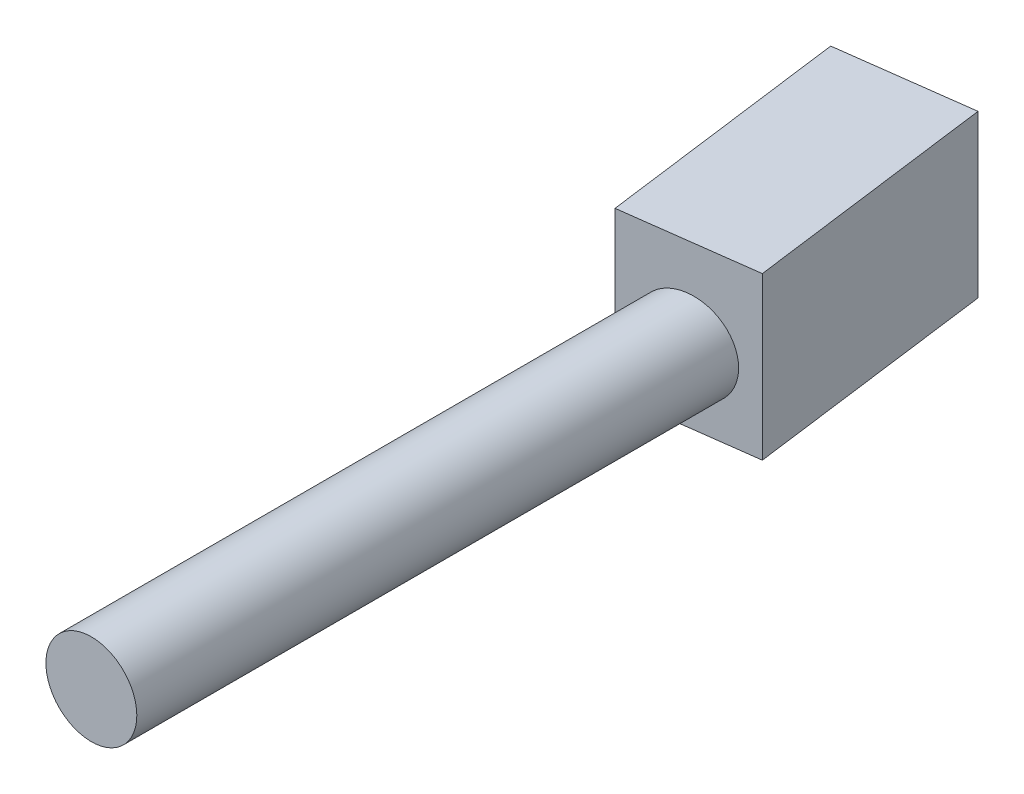
ISO-10303-21;
HEADER;
FILE_DESCRIPTION(('STEP AP214'),'2;1');
FILE_NAME('part.step','',(''),(''),'','','');
FILE_SCHEMA(('AUTOMOTIVE_DESIGN { 1 0 10303 214 1 1 1 1 }'));
ENDSEC;
DATA;
#1=APPLICATION_CONTEXT('core data for automotive mechanical design processes');
#2=APPLICATION_PROTOCOL_DEFINITION('international standard','automotive_design',2000,#1);
#3=PRODUCT_CONTEXT('',#1,'mechanical');
#4=PRODUCT('Part','Part','',(#3));
#5=PRODUCT_RELATED_PRODUCT_CATEGORY('part','',(#4));
#6=PRODUCT_DEFINITION_FORMATION('','',#4);
#7=PRODUCT_DEFINITION_CONTEXT('part definition',#1,'design');
#8=PRODUCT_DEFINITION('design','',#6,#7);
#9=PRODUCT_DEFINITION_SHAPE('','',#8);
#10=(LENGTH_UNIT() NAMED_UNIT(*) SI_UNIT(.MILLI.,.METRE.));
#11=(NAMED_UNIT(*) PLANE_ANGLE_UNIT() SI_UNIT($,.RADIAN.));
#12=(NAMED_UNIT(*) SI_UNIT($,.STERADIAN.) SOLID_ANGLE_UNIT());
#13=UNCERTAINTY_MEASURE_WITH_UNIT(LENGTH_MEASURE(1.E-05),#10,'distance_accuracy_value','');
#14=(GEOMETRIC_REPRESENTATION_CONTEXT(3) GLOBAL_UNCERTAINTY_ASSIGNED_CONTEXT((#13)) GLOBAL_UNIT_ASSIGNED_CONTEXT((#10,
#11,#12)) REPRESENTATION_CONTEXT('',''));
#15=CARTESIAN_POINT('',(0.,0.,0.));
#16=DIRECTION('',(0.,0.,1.));
#17=DIRECTION('',(1.,0.,0.));
#18=AXIS2_PLACEMENT_3D('',#15,#16,#17);
#19=CARTESIAN_POINT('',(181.57313432794,-49.5,148.35860298786));
#20=DIRECTION('',(0.,0.,1.));
#21=DIRECTION('',(1.,0.,0.));
#22=AXIS2_PLACEMENT_3D('',#19,#20,#21);
#23=PLANE('',#22);
#24=CARTESIAN_POINT('',(181.57313432794,-49.5,148.35860298786));
#25=DIRECTION('',(0.,0.,1.));
#26=DIRECTION('',(1.,0.,0.));
#27=AXIS2_PLACEMENT_3D('',#24,#25,#26);
#28=CIRCLE('',#27,2.25);
#29=CARTESIAN_POINT('',(183.82313432794,-49.5,148.35860298786));
#30=VERTEX_POINT('',#29);
#31=EDGE_CURVE('E9',#30,#30,#28,.T.);
#32=ORIENTED_EDGE('',*,*,#31,.T.);
#33=EDGE_LOOP('',(#32));
#34=FACE_BOUND('',#33,.T.);
#35=ADVANCED_FACE('F14',(#34),#23,.T.);
#36=CARTESIAN_POINT('',(181.57313432794,-49.5,118.35860298786));
#37=DIRECTION('',(0.,0.,1.));
#38=DIRECTION('',(1.,0.,0.));
#39=AXIS2_PLACEMENT_3D('',#36,#37,#38);
#40=CYLINDRICAL_SURFACE('',#39,2.25);
#41=DIRECTION('',(0.,0.,1.));
#42=VECTOR('',#41,1.);
#43=CARTESIAN_POINT('',(183.82313432794,-49.5,118.35860298786));
#44=LINE('',#43,#42);
#45=CARTESIAN_POINT('',(183.82313432794,-49.5,118.56669934858));
#46=VERTEX_POINT('',#45);
#47=EDGE_CURVE('E25',#46,#30,#44,.T.);
#48=ORIENTED_EDGE('',*,*,#47,.T.);
#49=ORIENTED_EDGE('',*,*,#31,.F.);
#50=ORIENTED_EDGE('',*,*,#47,.F.);
#51=CARTESIAN_POINT('',(181.57313432794,-49.5,118.86291746815));
#52=DIRECTION('',(0.130526192219976,0.,0.99144486137382));
#53=DIRECTION('',(-0.99144486137382,0.,0.130526192219976));
#54=AXIS2_PLACEMENT_3D('',#51,#52,#53);
#55=ELLIPSE('',#54,2.269415161305,2.25);
#56=EDGE_CURVE('E118',#46,#46,#55,.T.);
#57=ORIENTED_EDGE('',*,*,#56,.T.);
#58=EDGE_LOOP('',(#48,#49,#50,#57));
#59=FACE_BOUND('',#58,.T.);
#60=ADVANCED_FACE('F141',(#59),#40,.T.);
#61=CARTESIAN_POINT('',(183.24206843999,-53.,106.1361990128));
#62=DIRECTION('',(0.99144486137382,0.,-0.130526192219976));
#63=DIRECTION('',(0.,-1.,0.));
#64=AXIS2_PLACEMENT_3D('',#61,#62,#63);
#65=PLANE('',#64);
#66=DIRECTION('',(0.130526192219976,0.,0.99144486137382));
#67=VECTOR('',#66,1.);
#68=CARTESIAN_POINT('',(183.24206843999,-53.,106.1361990128));
#69=LINE('',#68,#67);
#70=CARTESIAN_POINT('',(183.24206843999,-53.,106.1361990128));
#71=VERTEX_POINT('',#70);
#72=CARTESIAN_POINT('',(184.86059322352,-53.,118.43011529383));
#73=VERTEX_POINT('',#72);
#74=EDGE_CURVE('E80',#71,#73,#69,.T.);
#75=ORIENTED_EDGE('',*,*,#74,.F.);
#76=DIRECTION('',(0.,1.,0.));
#77=VECTOR('',#76,1.);
#78=CARTESIAN_POINT('',(183.24206843999,-53.,106.1361990128));
#79=LINE('',#78,#77);
#80=CARTESIAN_POINT('',(183.24206843999,-45.,106.1361990128));
#81=VERTEX_POINT('',#80);
#82=EDGE_CURVE('E110',#71,#81,#79,.T.);
#83=ORIENTED_EDGE('',*,*,#82,.T.);
#84=DIRECTION('',(0.130526192219976,0.,0.99144486137382));
#85=VECTOR('',#84,1.);
#86=CARTESIAN_POINT('',(183.24206843999,-45.,106.1361990128));
#87=LINE('',#86,#85);
#88=CARTESIAN_POINT('',(184.86059322352,-45.,118.43011529383));
#89=VERTEX_POINT('',#88);
#90=EDGE_CURVE('E69',#81,#89,#87,.T.);
#91=ORIENTED_EDGE('',*,*,#90,.T.);
#92=DIRECTION('',(0.,1.,0.));
#93=VECTOR('',#92,1.);
#94=CARTESIAN_POINT('',(184.86059322352,-53.,118.43011529383));
#95=LINE('',#94,#93);
#96=EDGE_CURVE('E76',#73,#89,#95,.T.);
#97=ORIENTED_EDGE('',*,*,#96,.F.);
#98=EDGE_LOOP('',(#75,#83,#91,#97));
#99=FACE_BOUND('',#98,.T.);
#100=ADVANCED_FACE('F78',(#99),#65,.T.);
#101=CARTESIAN_POINT('',(176.79767684106,-53.,106.98461926223));
#102=DIRECTION('',(0.130526192219976,0.,0.99144486137382));
#103=DIRECTION('',(0.,-1.,0.));
#104=AXIS2_PLACEMENT_3D('',#101,#102,#103);
#105=PLANE('',#104);
#106=DIRECTION('',(0.99144486137382,0.,-0.130526192219976));
#107=VECTOR('',#106,1.);
#108=CARTESIAN_POINT('',(176.79767684106,-45.,106.98461926223));
#109=LINE('',#108,#107);
#110=CARTESIAN_POINT('',(176.79767684106,-45.,106.98461926223));
#111=VERTEX_POINT('',#110);
#112=EDGE_CURVE('E18',#111,#81,#109,.T.);
#113=ORIENTED_EDGE('',*,*,#112,.T.);
#114=ORIENTED_EDGE('',*,*,#82,.F.);
#115=DIRECTION('',(0.99144486137382,0.,-0.130526192219976));
#116=VECTOR('',#115,1.);
#117=CARTESIAN_POINT('',(176.79767684106,-53.,106.98461926223));
#118=LINE('',#117,#116);
#119=CARTESIAN_POINT('',(176.79767684106,-53.,106.98461926223));
#120=VERTEX_POINT('',#119);
#121=EDGE_CURVE('E84',#120,#71,#118,.T.);
#122=ORIENTED_EDGE('',*,*,#121,.F.);
#123=DIRECTION('',(0.,1.,0.));
#124=VECTOR('',#123,1.);
#125=CARTESIAN_POINT('',(176.79767684106,-53.,106.98461926223));
#126=LINE('',#125,#124);
#127=EDGE_CURVE('E105',#120,#111,#126,.T.);
#128=ORIENTED_EDGE('',*,*,#127,.T.);
#129=EDGE_LOOP('',(#113,#114,#122,#128));
#130=FACE_BOUND('',#129,.T.);
#131=ADVANCED_FACE('F132',(#130),#105,.F.);
#132=CARTESIAN_POINT('',(176.79767684106,-45.,106.98461926223));
#133=DIRECTION('',(0.,1.,0.));
#134=DIRECTION('',(1.,0.,0.));
#135=AXIS2_PLACEMENT_3D('',#132,#133,#134);
#136=PLANE('',#135);
#137=ORIENTED_EDGE('',*,*,#112,.F.);
#138=DIRECTION('',(0.130526192219976,0.,0.99144486137382));
#139=VECTOR('',#138,1.);
#140=CARTESIAN_POINT('',(176.79767684106,-45.,106.98461926223));
#141=LINE('',#140,#139);
#142=CARTESIAN_POINT('',(178.41620162459,-45.,119.27853554326));
#143=VERTEX_POINT('',#142);
#144=EDGE_CURVE('E113',#111,#143,#141,.T.);
#145=ORIENTED_EDGE('',*,*,#144,.T.);
#146=DIRECTION('',(0.99144486137382,0.,-0.130526192219976));
#147=VECTOR('',#146,1.);
#148=CARTESIAN_POINT('',(178.41620162459,-45.,119.27853554326));
#149=LINE('',#148,#147);
#150=EDGE_CURVE('E83',#143,#89,#149,.T.);
#151=ORIENTED_EDGE('',*,*,#150,.T.);
#152=ORIENTED_EDGE('',*,*,#90,.F.);
#153=EDGE_LOOP('',(#137,#145,#151,#152));
#154=FACE_BOUND('',#153,.T.);
#155=ADVANCED_FACE('F152',(#154),#136,.T.);
#156=CARTESIAN_POINT('',(178.41620162459,-53.,119.27853554326));
#157=DIRECTION('',(0.130526192219976,0.,0.99144486137382));
#158=DIRECTION('',(0.,-1.,0.));
#159=AXIS2_PLACEMENT_3D('',#156,#157,#158);
#160=PLANE('',#159);
#161=ORIENTED_EDGE('',*,*,#56,.F.);
#162=EDGE_LOOP('',(#161));
#163=FACE_BOUND('',#162,.T.);
#164=DIRECTION('',(0.,1.,0.));
#165=VECTOR('',#164,1.);
#166=CARTESIAN_POINT('',(178.41620162459,-53.,119.27853554326));
#167=LINE('',#166,#165);
#168=CARTESIAN_POINT('',(178.41620162459,-53.,119.27853554326));
#169=VERTEX_POINT('',#168);
#170=EDGE_CURVE('E90',#169,#143,#167,.T.);
#171=ORIENTED_EDGE('',*,*,#170,.F.);
#172=DIRECTION('',(0.99144486137382,0.,-0.130526192219976));
#173=VECTOR('',#172,1.);
#174=CARTESIAN_POINT('',(178.41620162459,-53.,119.27853554326));
#175=LINE('',#174,#173);
#176=EDGE_CURVE('E87',#169,#73,#175,.T.);
#177=ORIENTED_EDGE('',*,*,#176,.T.);
#178=ORIENTED_EDGE('',*,*,#96,.T.);
#179=ORIENTED_EDGE('',*,*,#150,.F.);
#180=EDGE_LOOP('',(#171,#177,#178,#179));
#181=FACE_BOUND('',#180,.T.);
#182=ADVANCED_FACE('F88',(#163,#181),#160,.T.);
#183=CARTESIAN_POINT('',(176.79767684106,-53.,106.98461926223));
#184=DIRECTION('',(0.,1.,0.));
#185=DIRECTION('',(1.,0.,0.));
#186=AXIS2_PLACEMENT_3D('',#183,#184,#185);
#187=PLANE('',#186);
#188=ORIENTED_EDGE('',*,*,#74,.T.);
#189=ORIENTED_EDGE('',*,*,#176,.F.);
#190=DIRECTION('',(0.130526192219976,0.,0.99144486137382));
#191=VECTOR('',#190,1.);
#192=CARTESIAN_POINT('',(176.79767684106,-53.,106.98461926223));
#193=LINE('',#192,#191);
#194=EDGE_CURVE('E99',#120,#169,#193,.T.);
#195=ORIENTED_EDGE('',*,*,#194,.F.);
#196=ORIENTED_EDGE('',*,*,#121,.T.);
#197=EDGE_LOOP('',(#188,#189,#195,#196));
#198=FACE_BOUND('',#197,.T.);
#199=ADVANCED_FACE('F97',(#198),#187,.F.);
#200=CARTESIAN_POINT('',(176.79767684106,-53.,106.98461926223));
#201=DIRECTION('',(0.99144486137382,0.,-0.130526192219976));
#202=DIRECTION('',(0.,-1.,0.));
#203=AXIS2_PLACEMENT_3D('',#200,#201,#202);
#204=PLANE('',#203);
#205=ORIENTED_EDGE('',*,*,#170,.T.);
#206=ORIENTED_EDGE('',*,*,#144,.F.);
#207=ORIENTED_EDGE('',*,*,#127,.F.);
#208=ORIENTED_EDGE('',*,*,#194,.T.);
#209=EDGE_LOOP('',(#205,#206,#207,#208));
#210=FACE_BOUND('',#209,.T.);
#211=ADVANCED_FACE('F16',(#210),#204,.F.);
#212=CLOSED_SHELL('',(#35,#60,#100,#131,#155,#182,#199,#211));
#213=MANIFOLD_SOLID_BREP('B1',#212);
#214=ADVANCED_BREP_SHAPE_REPRESENTATION('',(#18,#213),#14);
#215=SHAPE_DEFINITION_REPRESENTATION(#9,#214);
ENDSEC;
END-ISO-10303-21;
